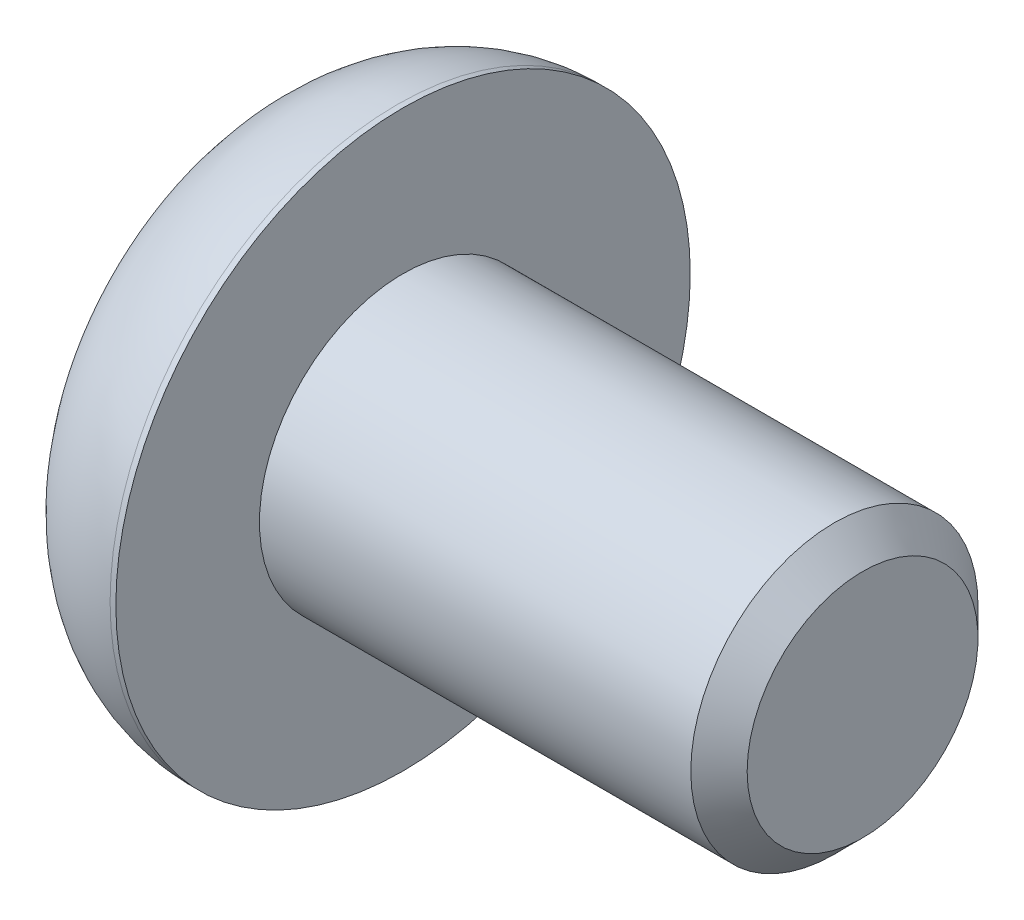
ISO-10303-21;
HEADER;
FILE_DESCRIPTION(('STEP AP214'),'2;1');
FILE_NAME('part.step','',(''),(''),'','','');
FILE_SCHEMA(('AUTOMOTIVE_DESIGN { 1 0 10303 214 1 1 1 1 }'));
ENDSEC;
DATA;
#1=APPLICATION_CONTEXT('core data for automotive mechanical design processes');
#2=APPLICATION_PROTOCOL_DEFINITION('international standard','automotive_design',2000,#1);
#3=PRODUCT_CONTEXT('',#1,'mechanical');
#4=PRODUCT('Part','Part','',(#3));
#5=PRODUCT_RELATED_PRODUCT_CATEGORY('part','',(#4));
#6=PRODUCT_DEFINITION_FORMATION('','',#4);
#7=PRODUCT_DEFINITION_CONTEXT('part definition',#1,'design');
#8=PRODUCT_DEFINITION('design','',#6,#7);
#9=PRODUCT_DEFINITION_SHAPE('','',#8);
#10=(LENGTH_UNIT() NAMED_UNIT(*) SI_UNIT(.MILLI.,.METRE.));
#11=(NAMED_UNIT(*) PLANE_ANGLE_UNIT() SI_UNIT($,.RADIAN.));
#12=(NAMED_UNIT(*) SI_UNIT($,.STERADIAN.) SOLID_ANGLE_UNIT());
#13=UNCERTAINTY_MEASURE_WITH_UNIT(LENGTH_MEASURE(1.E-05),#10,'distance_accuracy_value','');
#14=(GEOMETRIC_REPRESENTATION_CONTEXT(3) GLOBAL_UNCERTAINTY_ASSIGNED_CONTEXT((#13)) GLOBAL_UNIT_ASSIGNED_CONTEXT((#10,
#11,#12)) REPRESENTATION_CONTEXT('',''));
#15=CARTESIAN_POINT('',(0.,0.,0.));
#16=DIRECTION('',(0.,0.,1.));
#17=DIRECTION('',(1.,0.,0.));
#18=AXIS2_PLACEMENT_3D('',#15,#16,#17);
#19=CARTESIAN_POINT('',(1.93397459628386,0.,0.));
#20=DIRECTION('',(-1.,0.,0.));
#21=DIRECTION('',(0.,0.,1.));
#22=AXIS2_PLACEMENT_3D('',#19,#20,#21);
#23=CONICAL_SURFACE('',#22,1.499999999794,1.04719755099793);
#24=CARTESIAN_POINT('',(2.79999999995084,3.41060513164848E-10,0.));
#25=VERTEX_POINT('',#24);
#26=VERTEX_LOOP('',#25);
#27=FACE_BOUND('',#26,.T.);
#28=CARTESIAN_POINT('',(1.93397459621556,0.,0.));
#29=DIRECTION('',(1.,0.,0.));
#30=DIRECTION('',(0.,0.,-1.));
#31=AXIS2_PLACEMENT_3D('',#28,#29,#30);
#32=CIRCLE('',#31,1.5);
#33=CARTESIAN_POINT('',(1.93397459621556,0.,-1.5));
#34=VERTEX_POINT('',#33);
#35=EDGE_CURVE('E121',#34,#34,#32,.F.);
#36=ORIENTED_EDGE('',*,*,#35,.T.);
#37=EDGE_LOOP('',(#36));
#38=FACE_BOUND('',#37,.T.);
#39=ADVANCED_FACE('F17',(#27,#38),#23,.F.);
#40=CARTESIAN_POINT('',(0.966987298107781,0.,0.));
#41=DIRECTION('',(1.,0.,0.));
#42=DIRECTION('',(0.,0.,-1.));
#43=AXIS2_PLACEMENT_3D('',#40,#41,#42);
#44=CYLINDRICAL_SURFACE('',#43,1.5);
#45=ORIENTED_EDGE('',*,*,#35,.F.);
#46=EDGE_LOOP('',(#45));
#47=FACE_BOUND('',#46,.T.);
#48=CARTESIAN_POINT('',(1.82,0.,0.));
#49=DIRECTION('',(1.,0.,0.));
#50=DIRECTION('',(0.,0.,-1.));
#51=AXIS2_PLACEMENT_3D('',#48,#49,#50);
#52=CIRCLE('',#51,1.5);
#53=CARTESIAN_POINT('',(1.82,1.29903810567666,-0.75));
#54=VERTEX_POINT('',#53);
#55=CARTESIAN_POINT('',(1.82,1.29903810567666,0.749999999999999));
#56=VERTEX_POINT('',#55);
#57=EDGE_CURVE('E94',#54,#56,#52,.T.);
#58=ORIENTED_EDGE('',*,*,#57,.F.);
#59=CARTESIAN_POINT('',(1.82,0.,0.));
#60=DIRECTION('',(1.,0.,0.));
#61=DIRECTION('',(0.,0.,-1.));
#62=AXIS2_PLACEMENT_3D('',#59,#60,#61);
#63=CIRCLE('',#62,1.5);
#64=CARTESIAN_POINT('',(1.82,0.,-1.5));
#65=VERTEX_POINT('',#64);
#66=EDGE_CURVE('E102',#65,#54,#63,.T.);
#67=ORIENTED_EDGE('',*,*,#66,.F.);
#68=CARTESIAN_POINT('',(1.82,0.,0.));
#69=DIRECTION('',(1.,0.,0.));
#70=DIRECTION('',(0.,0.,-1.));
#71=AXIS2_PLACEMENT_3D('',#68,#69,#70);
#72=CIRCLE('',#71,1.5);
#73=CARTESIAN_POINT('',(1.82,-1.29903810567666,-0.749999999999999));
#74=VERTEX_POINT('',#73);
#75=EDGE_CURVE('E131',#65,#74,#72,.F.);
#76=ORIENTED_EDGE('',*,*,#75,.T.);
#77=CARTESIAN_POINT('',(1.82,0.,0.));
#78=DIRECTION('',(1.,0.,0.));
#79=DIRECTION('',(0.,0.,-1.));
#80=AXIS2_PLACEMENT_3D('',#77,#78,#79);
#81=CIRCLE('',#80,1.5);
#82=CARTESIAN_POINT('',(1.82,-1.29903810567666,0.750000000000001));
#83=VERTEX_POINT('',#82);
#84=EDGE_CURVE('E101',#74,#83,#81,.F.);
#85=ORIENTED_EDGE('',*,*,#84,.T.);
#86=CARTESIAN_POINT('',(1.82,0.,0.));
#87=DIRECTION('',(1.,0.,0.));
#88=DIRECTION('',(0.,0.,-1.));
#89=AXIS2_PLACEMENT_3D('',#86,#87,#88);
#90=CIRCLE('',#89,1.5);
#91=CARTESIAN_POINT('',(1.82,0.,1.5));
#92=VERTEX_POINT('',#91);
#93=EDGE_CURVE('E120',#92,#83,#90,.T.);
#94=ORIENTED_EDGE('',*,*,#93,.F.);
#95=CARTESIAN_POINT('',(1.82,0.,0.));
#96=DIRECTION('',(1.,0.,0.));
#97=DIRECTION('',(0.,0.,-1.));
#98=AXIS2_PLACEMENT_3D('',#95,#96,#97);
#99=CIRCLE('',#98,1.5);
#100=EDGE_CURVE('E20',#56,#92,#99,.T.);
#101=ORIENTED_EDGE('',*,*,#100,.F.);
#102=EDGE_LOOP('',(#58,#67,#76,#85,#94,#101));
#103=FACE_BOUND('',#102,.T.);
#104=ADVANCED_FACE('F118',(#47,#103),#44,.F.);
#105=CARTESIAN_POINT('',(1.82,0.,0.));
#106=DIRECTION('',(1.,0.,0.));
#107=DIRECTION('',(0.,0.,-1.));
#108=AXIS2_PLACEMENT_3D('',#105,#106,#107);
#109=PLANE('',#108);
#110=DIRECTION('',(0.,0.5,-0.866025403784439));
#111=VECTOR('',#110,1.);
#112=CARTESIAN_POINT('',(1.82,-0.866025403784439,-1.5));
#113=LINE('',#112,#111);
#114=CARTESIAN_POINT('',(1.82,-1.73205080756888,0.));
#115=VERTEX_POINT('',#114);
#116=EDGE_CURVE('E153',#74,#115,#113,.F.);
#117=ORIENTED_EDGE('',*,*,#116,.T.);
#118=DIRECTION('',(0.,-0.5,-0.866025403784439));
#119=VECTOR('',#118,1.);
#120=CARTESIAN_POINT('',(1.82,-1.73205080756888,0.));
#121=LINE('',#120,#119);
#122=EDGE_CURVE('E164',#115,#83,#121,.F.);
#123=ORIENTED_EDGE('',*,*,#122,.T.);
#124=ORIENTED_EDGE('',*,*,#84,.F.);
#125=EDGE_LOOP('',(#117,#123,#124));
#126=FACE_BOUND('',#125,.T.);
#127=ADVANCED_FACE('F415',(#126),#109,.F.);
#128=CARTESIAN_POINT('',(1.82,0.,0.));
#129=DIRECTION('',(1.,0.,0.));
#130=DIRECTION('',(0.,0.,-1.));
#131=AXIS2_PLACEMENT_3D('',#128,#129,#130);
#132=PLANE('',#131);
#133=DIRECTION('',(0.,1.,0.));
#134=VECTOR('',#133,1.);
#135=CARTESIAN_POINT('',(1.82,0.866025403784439,-1.5));
#136=LINE('',#135,#134);
#137=CARTESIAN_POINT('',(1.82,-0.866025403784439,-1.5));
#138=VERTEX_POINT('',#137);
#139=EDGE_CURVE('E174',#65,#138,#136,.F.);
#140=ORIENTED_EDGE('',*,*,#139,.T.);
#141=DIRECTION('',(0.,0.5,-0.866025403784439));
#142=VECTOR('',#141,1.);
#143=CARTESIAN_POINT('',(1.82,-0.866025403784439,-1.5));
#144=LINE('',#143,#142);
#145=EDGE_CURVE('E133',#138,#74,#144,.F.);
#146=ORIENTED_EDGE('',*,*,#145,.T.);
#147=ORIENTED_EDGE('',*,*,#75,.F.);
#148=EDGE_LOOP('',(#140,#146,#147));
#149=FACE_BOUND('',#148,.T.);
#150=ADVANCED_FACE('F405',(#149),#132,.F.);
#151=CARTESIAN_POINT('',(0.,-0.866025403784439,-1.5));
#152=DIRECTION('',(0.,-0.866025403784439,-0.5));
#153=DIRECTION('',(0.,0.5,-0.866025403784439));
#154=AXIS2_PLACEMENT_3D('',#151,#152,#153);
#155=PLANE('',#154);
#156=DIRECTION('',(1.,0.,0.));
#157=VECTOR('',#156,1.);
#158=CARTESIAN_POINT('',(0.,-1.73205080756888,0.));
#159=LINE('',#158,#157);
#160=CARTESIAN_POINT('',(0.,-1.73205080756888,0.));
#161=VERTEX_POINT('',#160);
#162=EDGE_CURVE('E159',#161,#115,#159,.T.);
#163=ORIENTED_EDGE('',*,*,#162,.T.);
#164=ORIENTED_EDGE('',*,*,#116,.F.);
#165=ORIENTED_EDGE('',*,*,#145,.F.);
#166=DIRECTION('',(-1.,0.,0.));
#167=VECTOR('',#166,1.);
#168=CARTESIAN_POINT('',(0.,-0.866025403784439,-1.5));
#169=LINE('',#168,#167);
#170=CARTESIAN_POINT('',(0.,-0.866025403784439,-1.5));
#171=VERTEX_POINT('',#170);
#172=EDGE_CURVE('E150',#138,#171,#169,.T.);
#173=ORIENTED_EDGE('',*,*,#172,.T.);
#174=DIRECTION('',(0.,0.5,-0.866025403784439));
#175=VECTOR('',#174,1.);
#176=CARTESIAN_POINT('',(0.,-0.866025403784439,-1.5));
#177=LINE('',#176,#175);
#178=EDGE_CURVE('E155',#161,#171,#177,.T.);
#179=ORIENTED_EDGE('',*,*,#178,.F.);
#180=EDGE_LOOP('',(#163,#164,#165,#173,#179));
#181=FACE_BOUND('',#180,.T.);
#182=ADVANCED_FACE('F395',(#181),#155,.F.);
#183=CARTESIAN_POINT('',(0.,-1.73205080756888,0.));
#184=DIRECTION('',(0.,-0.866025403784439,0.5));
#185=DIRECTION('',(0.,-0.5,-0.866025403784439));
#186=AXIS2_PLACEMENT_3D('',#183,#184,#185);
#187=PLANE('',#186);
#188=DIRECTION('',(1.,0.,0.));
#189=VECTOR('',#188,1.);
#190=CARTESIAN_POINT('',(0.,-0.866025403784439,1.5));
#191=LINE('',#190,#189);
#192=CARTESIAN_POINT('',(0.,-0.86602540378444,1.5));
#193=VERTEX_POINT('',#192);
#194=CARTESIAN_POINT('',(1.82,-0.866025403784439,1.5));
#195=VERTEX_POINT('',#194);
#196=EDGE_CURVE('E149',#193,#195,#191,.T.);
#197=ORIENTED_EDGE('',*,*,#196,.T.);
#198=DIRECTION('',(0.,-0.500000000000001,-0.866025403784438));
#199=VECTOR('',#198,1.);
#200=CARTESIAN_POINT('',(1.82,-0.866025403784439,1.5));
#201=LINE('',#200,#199);
#202=EDGE_CURVE('E187',#195,#83,#201,.T.);
#203=ORIENTED_EDGE('',*,*,#202,.T.);
#204=ORIENTED_EDGE('',*,*,#122,.F.);
#205=ORIENTED_EDGE('',*,*,#162,.F.);
#206=DIRECTION('',(0.,-0.5,-0.866025403784439));
#207=VECTOR('',#206,1.);
#208=CARTESIAN_POINT('',(0.,-1.73205080756888,0.));
#209=LINE('',#208,#207);
#210=EDGE_CURVE('E169',#193,#161,#209,.T.);
#211=ORIENTED_EDGE('',*,*,#210,.F.);
#212=EDGE_LOOP('',(#197,#203,#204,#205,#211));
#213=FACE_BOUND('',#212,.T.);
#214=ADVANCED_FACE('F386',(#213),#187,.F.);
#215=CARTESIAN_POINT('',(1.82,0.,0.));
#216=DIRECTION('',(1.,0.,0.));
#217=DIRECTION('',(0.,0.,-1.));
#218=AXIS2_PLACEMENT_3D('',#215,#216,#217);
#219=PLANE('',#218);
#220=ORIENTED_EDGE('',*,*,#202,.F.);
#221=DIRECTION('',(0.,1.,0.));
#222=VECTOR('',#221,1.);
#223=CARTESIAN_POINT('',(1.82,-0.866025403784439,1.5));
#224=LINE('',#223,#222);
#225=EDGE_CURVE('E194',#195,#92,#224,.T.);
#226=ORIENTED_EDGE('',*,*,#225,.T.);
#227=ORIENTED_EDGE('',*,*,#93,.T.);
#228=EDGE_LOOP('',(#220,#226,#227));
#229=FACE_BOUND('',#228,.T.);
#230=ADVANCED_FACE('F376',(#229),#219,.F.);
#231=CARTESIAN_POINT('',(1.82,0.,0.));
#232=DIRECTION('',(1.,0.,0.));
#233=DIRECTION('',(0.,0.,-1.));
#234=AXIS2_PLACEMENT_3D('',#231,#232,#233);
#235=PLANE('',#234);
#236=DIRECTION('',(0.,0.5,0.866025403784439));
#237=VECTOR('',#236,1.);
#238=CARTESIAN_POINT('',(1.82,1.73205080756888,0.));
#239=LINE('',#238,#237);
#240=CARTESIAN_POINT('',(1.82,0.866025403784441,-1.5));
#241=VERTEX_POINT('',#240);
#242=EDGE_CURVE('E204',#54,#241,#239,.F.);
#243=ORIENTED_EDGE('',*,*,#242,.T.);
#244=DIRECTION('',(0.,1.,0.));
#245=VECTOR('',#244,1.);
#246=CARTESIAN_POINT('',(1.82,0.866025403784439,-1.5));
#247=LINE('',#246,#245);
#248=EDGE_CURVE('E182',#241,#65,#247,.F.);
#249=ORIENTED_EDGE('',*,*,#248,.T.);
#250=ORIENTED_EDGE('',*,*,#66,.T.);
#251=EDGE_LOOP('',(#243,#249,#250));
#252=FACE_BOUND('',#251,.T.);
#253=ADVANCED_FACE('F366',(#252),#235,.F.);
#254=CARTESIAN_POINT('',(0.,0.866025403784439,-1.5));
#255=DIRECTION('',(0.,0.,-1.));
#256=DIRECTION('',(-1.,0.,0.));
#257=AXIS2_PLACEMENT_3D('',#254,#255,#256);
#258=PLANE('',#257);
#259=ORIENTED_EDGE('',*,*,#172,.F.);
#260=ORIENTED_EDGE('',*,*,#139,.F.);
#261=ORIENTED_EDGE('',*,*,#248,.F.);
#262=DIRECTION('',(1.,0.,0.));
#263=VECTOR('',#262,1.);
#264=CARTESIAN_POINT('',(0.,0.866025403784441,-1.5));
#265=LINE('',#264,#263);
#266=CARTESIAN_POINT('',(0.,0.86602540378444,-1.5));
#267=VERTEX_POINT('',#266);
#268=EDGE_CURVE('E201',#241,#267,#265,.F.);
#269=ORIENTED_EDGE('',*,*,#268,.T.);
#270=DIRECTION('',(0.,1.,0.));
#271=VECTOR('',#270,1.);
#272=CARTESIAN_POINT('',(0.,0.866025403784439,-1.5));
#273=LINE('',#272,#271);
#274=EDGE_CURVE('E147',#171,#267,#273,.T.);
#275=ORIENTED_EDGE('',*,*,#274,.F.);
#276=EDGE_LOOP('',(#259,#260,#261,#269,#275));
#277=FACE_BOUND('',#276,.T.);
#278=ADVANCED_FACE('F356',(#277),#258,.F.);
#279=CARTESIAN_POINT('',(0.,-0.866025403784439,1.5));
#280=DIRECTION('',(0.,0.,1.));
#281=DIRECTION('',(1.,0.,0.));
#282=AXIS2_PLACEMENT_3D('',#279,#280,#281);
#283=PLANE('',#282);
#284=DIRECTION('',(1.,0.,0.));
#285=VECTOR('',#284,1.);
#286=CARTESIAN_POINT('',(0.,0.866025403784439,1.5));
#287=LINE('',#286,#285);
#288=CARTESIAN_POINT('',(0.,0.866025403784439,1.5));
#289=VERTEX_POINT('',#288);
#290=CARTESIAN_POINT('',(1.82,0.866025403784439,1.5));
#291=VERTEX_POINT('',#290);
#292=EDGE_CURVE('E115',#289,#291,#287,.T.);
#293=ORIENTED_EDGE('',*,*,#292,.T.);
#294=DIRECTION('',(0.,1.,0.));
#295=VECTOR('',#294,1.);
#296=CARTESIAN_POINT('',(1.82,0.,1.5));
#297=LINE('',#296,#295);
#298=EDGE_CURVE('E114',#291,#92,#297,.F.);
#299=ORIENTED_EDGE('',*,*,#298,.T.);
#300=ORIENTED_EDGE('',*,*,#225,.F.);
#301=ORIENTED_EDGE('',*,*,#196,.F.);
#302=DIRECTION('',(0.,1.,0.));
#303=VECTOR('',#302,1.);
#304=CARTESIAN_POINT('',(0.,-0.866025403784439,1.5));
#305=LINE('',#304,#303);
#306=EDGE_CURVE('E198',#289,#193,#305,.F.);
#307=ORIENTED_EDGE('',*,*,#306,.F.);
#308=EDGE_LOOP('',(#293,#299,#300,#301,#307));
#309=FACE_BOUND('',#308,.T.);
#310=ADVANCED_FACE('F347',(#309),#283,.F.);
#311=CARTESIAN_POINT('',(1.82,0.,0.));
#312=DIRECTION('',(1.,0.,0.));
#313=DIRECTION('',(0.,0.,-1.));
#314=AXIS2_PLACEMENT_3D('',#311,#312,#313);
#315=PLANE('',#314);
#316=ORIENTED_EDGE('',*,*,#298,.F.);
#317=DIRECTION('',(0.,-0.5,0.866025403784439));
#318=VECTOR('',#317,1.);
#319=CARTESIAN_POINT('',(1.82,0.866025403784439,1.5));
#320=LINE('',#319,#318);
#321=EDGE_CURVE('E109',#291,#56,#320,.F.);
#322=ORIENTED_EDGE('',*,*,#321,.T.);
#323=ORIENTED_EDGE('',*,*,#100,.T.);
#324=EDGE_LOOP('',(#316,#322,#323));
#325=FACE_BOUND('',#324,.T.);
#326=ADVANCED_FACE('F113',(#325),#315,.F.);
#327=CARTESIAN_POINT('',(1.82,0.,0.));
#328=DIRECTION('',(1.,0.,0.));
#329=DIRECTION('',(0.,0.,-1.));
#330=AXIS2_PLACEMENT_3D('',#327,#328,#329);
#331=PLANE('',#330);
#332=DIRECTION('',(0.,-0.5,0.866025403784439));
#333=VECTOR('',#332,1.);
#334=CARTESIAN_POINT('',(1.82,0.866025403784439,1.5));
#335=LINE('',#334,#333);
#336=CARTESIAN_POINT('',(1.82,1.73205080756888,0.));
#337=VERTEX_POINT('',#336);
#338=EDGE_CURVE('E97',#56,#337,#335,.F.);
#339=ORIENTED_EDGE('',*,*,#338,.T.);
#340=DIRECTION('',(0.,0.5,0.866025403784439));
#341=VECTOR('',#340,1.);
#342=CARTESIAN_POINT('',(1.82,1.73205080756888,0.));
#343=LINE('',#342,#341);
#344=EDGE_CURVE('E99',#337,#54,#343,.F.);
#345=ORIENTED_EDGE('',*,*,#344,.T.);
#346=ORIENTED_EDGE('',*,*,#57,.T.);
#347=EDGE_LOOP('',(#339,#345,#346));
#348=FACE_BOUND('',#347,.T.);
#349=ADVANCED_FACE('F96',(#348),#331,.F.);
#350=CARTESIAN_POINT('',(0.,1.73205080756888,0.));
#351=DIRECTION('',(0.,0.866025403784439,-0.5));
#352=DIRECTION('',(0.,0.5,0.866025403784439));
#353=AXIS2_PLACEMENT_3D('',#350,#351,#352);
#354=PLANE('',#353);
#355=ORIENTED_EDGE('',*,*,#268,.F.);
#356=ORIENTED_EDGE('',*,*,#242,.F.);
#357=ORIENTED_EDGE('',*,*,#344,.F.);
#358=DIRECTION('',(1.,0.,0.));
#359=VECTOR('',#358,1.);
#360=CARTESIAN_POINT('',(0.,1.73205080756888,0.));
#361=LINE('',#360,#359);
#362=CARTESIAN_POINT('',(0.,1.73205080756888,0.));
#363=VERTEX_POINT('',#362);
#364=EDGE_CURVE('E111',#337,#363,#361,.F.);
#365=ORIENTED_EDGE('',*,*,#364,.T.);
#366=DIRECTION('',(0.,0.5,0.866025403784439));
#367=VECTOR('',#366,1.);
#368=CARTESIAN_POINT('',(0.,1.73205080756888,0.));
#369=LINE('',#368,#367);
#370=EDGE_CURVE('E35',#267,#363,#369,.T.);
#371=ORIENTED_EDGE('',*,*,#370,.F.);
#372=EDGE_LOOP('',(#355,#356,#357,#365,#371));
#373=FACE_BOUND('',#372,.T.);
#374=ADVANCED_FACE('F321',(#373),#354,.F.);
#375=CARTESIAN_POINT('',(0.,0.866025403784439,1.5));
#376=DIRECTION('',(0.,0.866025403784439,0.5));
#377=DIRECTION('',(0.,-0.5,0.866025403784439));
#378=AXIS2_PLACEMENT_3D('',#375,#376,#377);
#379=PLANE('',#378);
#380=ORIENTED_EDGE('',*,*,#364,.F.);
#381=ORIENTED_EDGE('',*,*,#338,.F.);
#382=ORIENTED_EDGE('',*,*,#321,.F.);
#383=ORIENTED_EDGE('',*,*,#292,.F.);
#384=DIRECTION('',(0.,-0.500000000000001,0.866025403784438));
#385=VECTOR('',#384,1.);
#386=CARTESIAN_POINT('',(0.,1.73205080756888,0.));
#387=LINE('',#386,#385);
#388=EDGE_CURVE('E138',#363,#289,#387,.T.);
#389=ORIENTED_EDGE('',*,*,#388,.F.);
#390=EDGE_LOOP('',(#380,#381,#382,#383,#389));
#391=FACE_BOUND('',#390,.T.);
#392=ADVANCED_FACE('F107',(#391),#379,.F.);
#393=CARTESIAN_POINT('',(0.,1.15,0.));
#394=DIRECTION('',(-1.,0.,0.));
#395=DIRECTION('',(0.,0.,1.));
#396=AXIS2_PLACEMENT_3D('',#393,#394,#395);
#397=PLANE('',#396);
#398=CARTESIAN_POINT('',(0.,0.,0.));
#399=DIRECTION('',(-1.,0.,0.));
#400=DIRECTION('',(0.,0.,1.));
#401=AXIS2_PLACEMENT_3D('',#398,#399,#400);
#402=CIRCLE('',#401,2.3);
#403=CARTESIAN_POINT('',(0.,0.,2.3));
#404=VERTEX_POINT('',#403);
#405=EDGE_CURVE('E134',#404,#404,#402,.F.);
#406=ORIENTED_EDGE('',*,*,#405,.F.);
#407=EDGE_LOOP('',(#406));
#408=FACE_BOUND('',#407,.T.);
#409=ORIENTED_EDGE('',*,*,#370,.T.);
#410=ORIENTED_EDGE('',*,*,#388,.T.);
#411=ORIENTED_EDGE('',*,*,#306,.T.);
#412=ORIENTED_EDGE('',*,*,#210,.T.);
#413=ORIENTED_EDGE('',*,*,#178,.T.);
#414=ORIENTED_EDGE('',*,*,#274,.T.);
#415=EDGE_LOOP('',(#409,#410,#411,#412,#413,#414));
#416=FACE_BOUND('',#415,.T.);
#417=ADVANCED_FACE('F302',(#408,#416),#397,.T.);
#418=CARTESIAN_POINT('',(2.7,0.,0.));
#419=DIRECTION('',(-1.,0.,0.));
#420=DIRECTION('',(0.,1.,0.));
#421=AXIS2_PLACEMENT_3D('',#418,#419,#420);
#422=DEGENERATE_TOROIDAL_SURFACE('',#421,2.3,2.7,.T.);
#423=ORIENTED_EDGE('',*,*,#405,.T.);
#424=EDGE_LOOP('',(#423));
#425=FACE_BOUND('',#424,.T.);
#426=CARTESIAN_POINT('',(2.7,0.,0.));
#427=DIRECTION('',(1.,0.,0.));
#428=DIRECTION('',(0.,0.,-1.));
#429=AXIS2_PLACEMENT_3D('',#426,#427,#428);
#430=CIRCLE('',#429,5.);
#431=CARTESIAN_POINT('',(2.7,0.,-5.));
#432=VERTEX_POINT('',#431);
#433=EDGE_CURVE('E137',#432,#432,#430,.T.);
#434=ORIENTED_EDGE('',*,*,#433,.F.);
#435=EDGE_LOOP('',(#434));
#436=FACE_BOUND('',#435,.T.);
#437=ADVANCED_FACE('F292',(#425,#436),#422,.T.);
#438=CARTESIAN_POINT('',(10.8,1.00475,0.));
#439=DIRECTION('',(1.,0.,0.));
#440=DIRECTION('',(0.,0.,-1.));
#441=AXIS2_PLACEMENT_3D('',#438,#439,#440);
#442=PLANE('',#441);
#443=CARTESIAN_POINT('',(10.7999999999606,0.,0.));
#444=DIRECTION('',(-1.,0.,0.));
#445=DIRECTION('',(0.,0.,1.));
#446=AXIS2_PLACEMENT_3D('',#443,#444,#445);
#447=CIRCLE('',#446,2.00949999992872);
#448=CARTESIAN_POINT('',(10.7999999999606,0.,2.00949999992872));
#449=VERTEX_POINT('',#448);
#450=EDGE_CURVE('E139',#449,#449,#447,.T.);
#451=ORIENTED_EDGE('',*,*,#450,.F.);
#452=EDGE_LOOP('',(#451));
#453=FACE_BOUND('',#452,.T.);
#454=ADVANCED_FACE('F257',(#453),#442,.T.);
#455=CARTESIAN_POINT('',(2.75,0.,0.));
#456=DIRECTION('',(1.,0.,0.));
#457=DIRECTION('',(0.,0.,-1.));
#458=AXIS2_PLACEMENT_3D('',#455,#456,#457);
#459=CYLINDRICAL_SURFACE('',#458,5.);
#460=ORIENTED_EDGE('',*,*,#433,.T.);
#461=EDGE_LOOP('',(#460));
#462=FACE_BOUND('',#461,.T.);
#463=CARTESIAN_POINT('',(2.8,0.,0.));
#464=DIRECTION('',(1.,0.,0.));
#465=DIRECTION('',(0.,0.,-1.));
#466=AXIS2_PLACEMENT_3D('',#463,#464,#465);
#467=CIRCLE('',#466,5.);
#468=CARTESIAN_POINT('',(2.8,0.,-5.));
#469=VERTEX_POINT('',#468);
#470=EDGE_CURVE('E142',#469,#469,#467,.T.);
#471=ORIENTED_EDGE('',*,*,#470,.F.);
#472=EDGE_LOOP('',(#471));
#473=FACE_BOUND('',#472,.T.);
#474=ADVANCED_FACE('F247',(#462,#473),#459,.T.);
#475=CARTESIAN_POINT('',(10.3094999998348,0.,0.));
#476=DIRECTION('',(-1.,0.,0.));
#477=DIRECTION('',(0.,0.,1.));
#478=AXIS2_PLACEMENT_3D('',#475,#476,#477);
#479=CONICAL_SURFACE('',#478,2.50000000005457,0.785398163397448);
#480=ORIENTED_EDGE('',*,*,#450,.T.);
#481=EDGE_LOOP('',(#480));
#482=FACE_BOUND('',#481,.T.);
#483=CARTESIAN_POINT('',(10.3095,0.,0.));
#484=DIRECTION('',(1.,0.,0.));
#485=DIRECTION('',(0.,0.,-1.));
#486=AXIS2_PLACEMENT_3D('',#483,#484,#485);
#487=CIRCLE('',#486,2.5);
#488=CARTESIAN_POINT('',(10.3095,0.,-2.5));
#489=VERTEX_POINT('',#488);
#490=EDGE_CURVE('E26',#489,#489,#487,.F.);
#491=ORIENTED_EDGE('',*,*,#490,.F.);
#492=EDGE_LOOP('',(#491));
#493=FACE_BOUND('',#492,.T.);
#494=ADVANCED_FACE('F244',(#482,#493),#479,.T.);
#495=CARTESIAN_POINT('',(2.8,3.75,0.));
#496=DIRECTION('',(1.,0.,0.));
#497=DIRECTION('',(0.,0.,-1.));
#498=AXIS2_PLACEMENT_3D('',#495,#496,#497);
#499=PLANE('',#498);
#500=CARTESIAN_POINT('',(2.8,0.,0.));
#501=DIRECTION('',(1.,0.,0.));
#502=DIRECTION('',(0.,0.,-1.));
#503=AXIS2_PLACEMENT_3D('',#500,#501,#502);
#504=CIRCLE('',#503,2.5);
#505=CARTESIAN_POINT('',(2.8,0.,-2.5));
#506=VERTEX_POINT('',#505);
#507=EDGE_CURVE('E11',#506,#506,#504,.T.);
#508=ORIENTED_EDGE('',*,*,#507,.F.);
#509=EDGE_LOOP('',(#508));
#510=FACE_BOUND('',#509,.T.);
#511=ORIENTED_EDGE('',*,*,#470,.T.);
#512=EDGE_LOOP('',(#511));
#513=FACE_BOUND('',#512,.T.);
#514=ADVANCED_FACE('F246',(#510,#513),#499,.T.);
#515=CARTESIAN_POINT('',(6.55475,0.,0.));
#516=DIRECTION('',(1.,0.,0.));
#517=DIRECTION('',(0.,0.,-1.));
#518=AXIS2_PLACEMENT_3D('',#515,#516,#517);
#519=CYLINDRICAL_SURFACE('',#518,2.5);
#520=ORIENTED_EDGE('',*,*,#490,.T.);
#521=EDGE_LOOP('',(#520));
#522=FACE_BOUND('',#521,.T.);
#523=ORIENTED_EDGE('',*,*,#507,.T.);
#524=EDGE_LOOP('',(#523));
#525=FACE_BOUND('',#524,.T.);
#526=ADVANCED_FACE('F241',(#522,#525),#519,.T.);
#527=CLOSED_SHELL('',(#39,#104,#127,#150,#182,#214,#230,#253,#278,#310,#326,#349,#374,#392,#417,
#437,#454,#474,#494,#514,#526));
#528=MANIFOLD_SOLID_BREP('B1',#527);
#529=ADVANCED_BREP_SHAPE_REPRESENTATION('',(#18,#528),#14);
#530=SHAPE_DEFINITION_REPRESENTATION(#9,#529);
ENDSEC;
END-ISO-10303-21;
